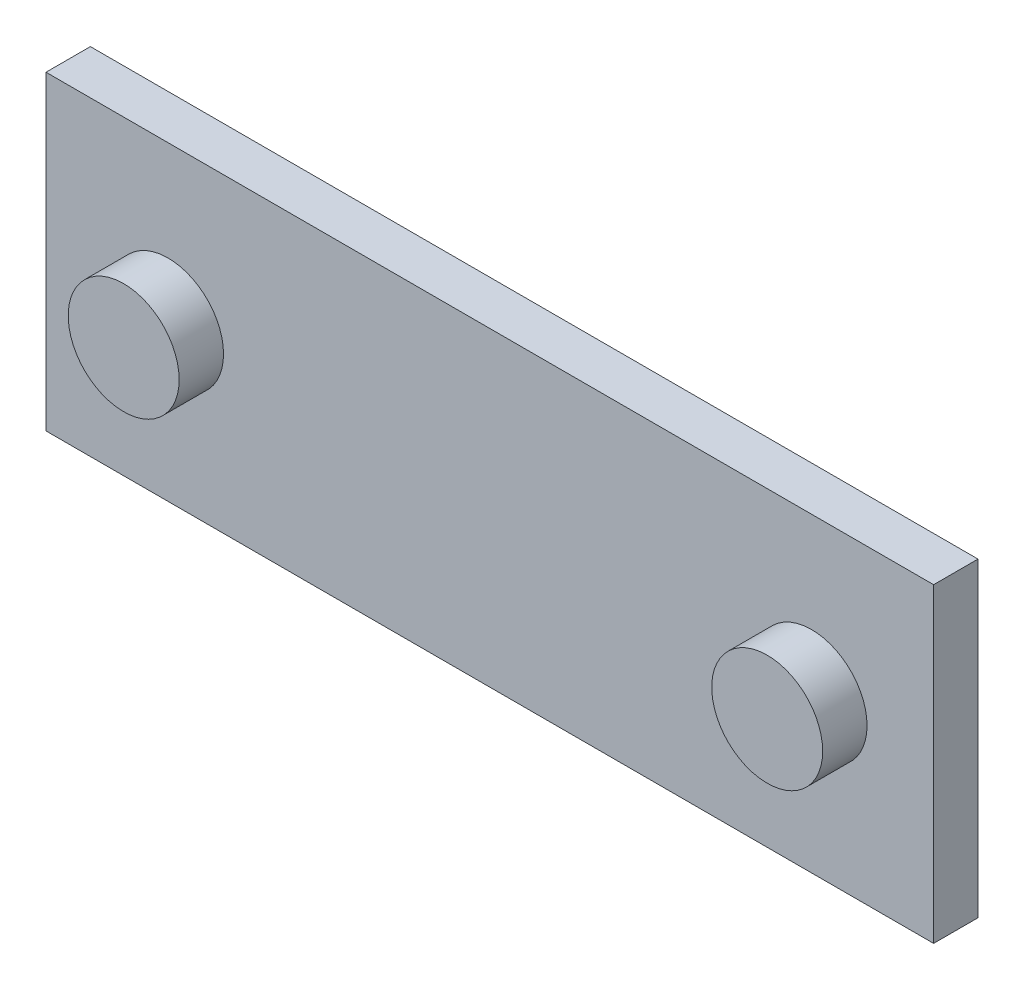
ISO-10303-21;
HEADER;
FILE_DESCRIPTION(('STEP AP214'),'2;1');
FILE_NAME('part.step','',(''),(''),'','','');
FILE_SCHEMA(('AUTOMOTIVE_DESIGN { 1 0 10303 214 1 1 1 1 }'));
ENDSEC;
DATA;
#1=APPLICATION_CONTEXT('core data for automotive mechanical design processes');
#2=APPLICATION_PROTOCOL_DEFINITION('international standard','automotive_design',2000,#1);
#3=PRODUCT_CONTEXT('',#1,'mechanical');
#4=PRODUCT('Part','Part','',(#3));
#5=PRODUCT_RELATED_PRODUCT_CATEGORY('part','',(#4));
#6=PRODUCT_DEFINITION_FORMATION('','',#4);
#7=PRODUCT_DEFINITION_CONTEXT('part definition',#1,'design');
#8=PRODUCT_DEFINITION('design','',#6,#7);
#9=PRODUCT_DEFINITION_SHAPE('','',#8);
#10=(LENGTH_UNIT() NAMED_UNIT(*) SI_UNIT(.MILLI.,.METRE.));
#11=(NAMED_UNIT(*) PLANE_ANGLE_UNIT() SI_UNIT($,.RADIAN.));
#12=(NAMED_UNIT(*) SI_UNIT($,.STERADIAN.) SOLID_ANGLE_UNIT());
#13=UNCERTAINTY_MEASURE_WITH_UNIT(LENGTH_MEASURE(1.E-05),#10,'distance_accuracy_value','');
#14=(GEOMETRIC_REPRESENTATION_CONTEXT(3) GLOBAL_UNCERTAINTY_ASSIGNED_CONTEXT((#13)) GLOBAL_UNIT_ASSIGNED_CONTEXT((#10,
#11,#12)) REPRESENTATION_CONTEXT('',''));
#15=CARTESIAN_POINT('',(0.,0.,0.));
#16=DIRECTION('',(0.,0.,1.));
#17=DIRECTION('',(1.,0.,0.));
#18=AXIS2_PLACEMENT_3D('',#15,#16,#17);
#19=CARTESIAN_POINT('',(-10.,-3.5,1.));
#20=DIRECTION('',(1.,0.,0.));
#21=DIRECTION('',(0.,0.,-1.));
#22=AXIS2_PLACEMENT_3D('',#19,#20,#21);
#23=PLANE('',#22);
#24=DIRECTION('',(0.,-1.,0.));
#25=VECTOR('',#24,1.);
#26=CARTESIAN_POINT('',(-10.,-3.5,0.));
#27=LINE('',#26,#25);
#28=CARTESIAN_POINT('',(-10.,3.5,0.));
#29=VERTEX_POINT('',#28);
#30=CARTESIAN_POINT('',(-10.,-3.5,0.));
#31=VERTEX_POINT('',#30);
#32=EDGE_CURVE('E107',#29,#31,#27,.T.);
#33=ORIENTED_EDGE('',*,*,#32,.T.);
#34=DIRECTION('',(0.,0.,-1.));
#35=VECTOR('',#34,1.);
#36=CARTESIAN_POINT('',(-10.,-3.5,1.));
#37=LINE('',#36,#35);
#38=CARTESIAN_POINT('',(-10.,-3.5,1.));
#39=VERTEX_POINT('',#38);
#40=EDGE_CURVE('E11',#39,#31,#37,.T.);
#41=ORIENTED_EDGE('',*,*,#40,.F.);
#42=DIRECTION('',(0.,-1.,0.));
#43=VECTOR('',#42,1.);
#44=CARTESIAN_POINT('',(-10.,-3.5,1.));
#45=LINE('',#44,#43);
#46=CARTESIAN_POINT('',(-10.,3.5,1.));
#47=VERTEX_POINT('',#46);
#48=EDGE_CURVE('E91',#47,#39,#45,.T.);
#49=ORIENTED_EDGE('',*,*,#48,.F.);
#50=DIRECTION('',(0.,0.,-1.));
#51=VECTOR('',#50,1.);
#52=CARTESIAN_POINT('',(-10.,3.5,1.));
#53=LINE('',#52,#51);
#54=EDGE_CURVE('E103',#47,#29,#53,.T.);
#55=ORIENTED_EDGE('',*,*,#54,.T.);
#56=EDGE_LOOP('',(#33,#41,#49,#55));
#57=FACE_BOUND('',#56,.T.);
#58=ADVANCED_FACE('F39',(#57),#23,.F.);
#59=CARTESIAN_POINT('',(10.,-3.5,1.));
#60=DIRECTION('',(0.,1.,0.));
#61=DIRECTION('',(-1.,0.,0.));
#62=AXIS2_PLACEMENT_3D('',#59,#60,#61);
#63=PLANE('',#62);
#64=DIRECTION('',(1.,0.,0.));
#65=VECTOR('',#64,1.);
#66=CARTESIAN_POINT('',(10.,-3.5,0.));
#67=LINE('',#66,#65);
#68=CARTESIAN_POINT('',(10.,-3.5,0.));
#69=VERTEX_POINT('',#68);
#70=EDGE_CURVE('E96',#31,#69,#67,.T.);
#71=ORIENTED_EDGE('',*,*,#70,.T.);
#72=DIRECTION('',(0.,0.,-1.));
#73=VECTOR('',#72,1.);
#74=CARTESIAN_POINT('',(10.,-3.5,1.));
#75=LINE('',#74,#73);
#76=CARTESIAN_POINT('',(10.,-3.5,1.));
#77=VERTEX_POINT('',#76);
#78=EDGE_CURVE('E48',#77,#69,#75,.T.);
#79=ORIENTED_EDGE('',*,*,#78,.F.);
#80=DIRECTION('',(1.,0.,0.));
#81=VECTOR('',#80,1.);
#82=CARTESIAN_POINT('',(10.,-3.5,1.));
#83=LINE('',#82,#81);
#84=EDGE_CURVE('E86',#39,#77,#83,.T.);
#85=ORIENTED_EDGE('',*,*,#84,.F.);
#86=ORIENTED_EDGE('',*,*,#40,.T.);
#87=EDGE_LOOP('',(#71,#79,#85,#86));
#88=FACE_BOUND('',#87,.T.);
#89=ADVANCED_FACE('F95',(#88),#63,.F.);
#90=CARTESIAN_POINT('',(10.,-3.5,1.));
#91=DIRECTION('',(-1.,0.,0.));
#92=DIRECTION('',(0.,0.,1.));
#93=AXIS2_PLACEMENT_3D('',#90,#91,#92);
#94=PLANE('',#93);
#95=DIRECTION('',(0.,1.,0.));
#96=VECTOR('',#95,1.);
#97=CARTESIAN_POINT('',(10.,-3.5,0.));
#98=LINE('',#97,#96);
#99=CARTESIAN_POINT('',(10.,3.5,0.));
#100=VERTEX_POINT('',#99);
#101=EDGE_CURVE('E73',#69,#100,#98,.T.);
#102=ORIENTED_EDGE('',*,*,#101,.T.);
#103=DIRECTION('',(0.,0.,-1.));
#104=VECTOR('',#103,1.);
#105=CARTESIAN_POINT('',(10.,3.5,1.));
#106=LINE('',#105,#104);
#107=CARTESIAN_POINT('',(10.,3.5,1.));
#108=VERTEX_POINT('',#107);
#109=EDGE_CURVE('E98',#108,#100,#106,.T.);
#110=ORIENTED_EDGE('',*,*,#109,.F.);
#111=DIRECTION('',(0.,1.,0.));
#112=VECTOR('',#111,1.);
#113=CARTESIAN_POINT('',(10.,-3.5,1.));
#114=LINE('',#113,#112);
#115=EDGE_CURVE('E89',#77,#108,#114,.T.);
#116=ORIENTED_EDGE('',*,*,#115,.F.);
#117=ORIENTED_EDGE('',*,*,#78,.T.);
#118=EDGE_LOOP('',(#102,#110,#116,#117));
#119=FACE_BOUND('',#118,.T.);
#120=ADVANCED_FACE('F99',(#119),#94,.F.);
#121=CARTESIAN_POINT('',(10.,3.5,1.));
#122=DIRECTION('',(0.,-1.,0.));
#123=DIRECTION('',(1.,0.,0.));
#124=AXIS2_PLACEMENT_3D('',#121,#122,#123);
#125=PLANE('',#124);
#126=DIRECTION('',(-1.,0.,0.));
#127=VECTOR('',#126,1.);
#128=CARTESIAN_POINT('',(10.,3.5,0.));
#129=LINE('',#128,#127);
#130=EDGE_CURVE('E79',#100,#29,#129,.T.);
#131=ORIENTED_EDGE('',*,*,#130,.T.);
#132=ORIENTED_EDGE('',*,*,#54,.F.);
#133=DIRECTION('',(-1.,0.,0.));
#134=VECTOR('',#133,1.);
#135=CARTESIAN_POINT('',(10.,3.5,1.));
#136=LINE('',#135,#134);
#137=EDGE_CURVE('E56',#108,#47,#136,.T.);
#138=ORIENTED_EDGE('',*,*,#137,.F.);
#139=ORIENTED_EDGE('',*,*,#109,.T.);
#140=EDGE_LOOP('',(#131,#132,#138,#139));
#141=FACE_BOUND('',#140,.T.);
#142=ADVANCED_FACE('F121',(#141),#125,.F.);
#143=CARTESIAN_POINT('',(0.,0.,1.));
#144=DIRECTION('',(0.,0.,1.));
#145=DIRECTION('',(1.,0.,0.));
#146=AXIS2_PLACEMENT_3D('',#143,#144,#145);
#147=PLANE('',#146);
#148=CARTESIAN_POINT('',(7.25,0.,1.));
#149=DIRECTION('',(0.,0.,1.));
#150=DIRECTION('',(1.,0.,0.));
#151=AXIS2_PLACEMENT_3D('',#148,#149,#150);
#152=CIRCLE('',#151,1.25);
#153=CARTESIAN_POINT('',(8.5,0.,1.));
#154=VERTEX_POINT('',#153);
#155=EDGE_CURVE('E136',#154,#154,#152,.T.);
#156=ORIENTED_EDGE('',*,*,#155,.F.);
#157=EDGE_LOOP('',(#156));
#158=FACE_BOUND('',#157,.T.);
#159=CARTESIAN_POINT('',(-7.25,0.,1.));
#160=DIRECTION('',(0.,0.,1.));
#161=DIRECTION('',(1.,0.,0.));
#162=AXIS2_PLACEMENT_3D('',#159,#160,#161);
#163=CIRCLE('',#162,1.25);
#164=CARTESIAN_POINT('',(-6.,0.,1.));
#165=VERTEX_POINT('',#164);
#166=EDGE_CURVE('E128',#165,#165,#163,.T.);
#167=ORIENTED_EDGE('',*,*,#166,.F.);
#168=EDGE_LOOP('',(#167));
#169=FACE_BOUND('',#168,.T.);
#170=ORIENTED_EDGE('',*,*,#48,.T.);
#171=ORIENTED_EDGE('',*,*,#84,.T.);
#172=ORIENTED_EDGE('',*,*,#115,.T.);
#173=ORIENTED_EDGE('',*,*,#137,.T.);
#174=EDGE_LOOP('',(#170,#171,#172,#173));
#175=FACE_BOUND('',#174,.T.);
#176=ADVANCED_FACE('F87',(#158,#169,#175),#147,.T.);
#177=CARTESIAN_POINT('',(0.,0.,0.));
#178=DIRECTION('',(0.,0.,1.));
#179=DIRECTION('',(1.,0.,0.));
#180=AXIS2_PLACEMENT_3D('',#177,#178,#179);
#181=PLANE('',#180);
#182=ORIENTED_EDGE('',*,*,#32,.F.);
#183=ORIENTED_EDGE('',*,*,#130,.F.);
#184=ORIENTED_EDGE('',*,*,#101,.F.);
#185=ORIENTED_EDGE('',*,*,#70,.F.);
#186=EDGE_LOOP('',(#182,#183,#184,#185));
#187=FACE_BOUND('',#186,.T.);
#188=ADVANCED_FACE('F124',(#187),#181,.F.);
#189=CARTESIAN_POINT('',(-7.25,0.,2.));
#190=DIRECTION('',(0.,0.,-1.));
#191=DIRECTION('',(-1.,0.,0.));
#192=AXIS2_PLACEMENT_3D('',#189,#190,#191);
#193=CYLINDRICAL_SURFACE('',#192,1.25);
#194=CARTESIAN_POINT('',(-7.25,0.,2.));
#195=DIRECTION('',(0.,0.,1.));
#196=DIRECTION('',(1.,0.,0.));
#197=AXIS2_PLACEMENT_3D('',#194,#195,#196);
#198=CIRCLE('',#197,1.25);
#199=CARTESIAN_POINT('',(-6.,0.,2.));
#200=VERTEX_POINT('',#199);
#201=EDGE_CURVE('E111',#200,#200,#198,.T.);
#202=ORIENTED_EDGE('',*,*,#201,.F.);
#203=EDGE_LOOP('',(#202));
#204=FACE_BOUND('',#203,.T.);
#205=ORIENTED_EDGE('',*,*,#166,.T.);
#206=EDGE_LOOP('',(#205));
#207=FACE_BOUND('',#206,.T.);
#208=ADVANCED_FACE('F158',(#204,#207),#193,.T.);
#209=CARTESIAN_POINT('',(-7.25,0.,2.));
#210=DIRECTION('',(0.,0.,1.));
#211=DIRECTION('',(1.,0.,0.));
#212=AXIS2_PLACEMENT_3D('',#209,#210,#211);
#213=PLANE('',#212);
#214=ORIENTED_EDGE('',*,*,#201,.T.);
#215=EDGE_LOOP('',(#214));
#216=FACE_BOUND('',#215,.T.);
#217=ADVANCED_FACE('F149',(#216),#213,.T.);
#218=CARTESIAN_POINT('',(7.25,0.,2.));
#219=DIRECTION('',(0.,0.,-1.));
#220=DIRECTION('',(-1.,0.,0.));
#221=AXIS2_PLACEMENT_3D('',#218,#219,#220);
#222=CYLINDRICAL_SURFACE('',#221,1.25);
#223=CARTESIAN_POINT('',(7.25,0.,2.));
#224=DIRECTION('',(0.,0.,1.));
#225=DIRECTION('',(1.,0.,0.));
#226=AXIS2_PLACEMENT_3D('',#223,#224,#225);
#227=CIRCLE('',#226,1.25);
#228=CARTESIAN_POINT('',(8.5,0.,2.));
#229=VERTEX_POINT('',#228);
#230=EDGE_CURVE('E132',#229,#229,#227,.T.);
#231=ORIENTED_EDGE('',*,*,#230,.F.);
#232=EDGE_LOOP('',(#231));
#233=FACE_BOUND('',#232,.T.);
#234=ORIENTED_EDGE('',*,*,#155,.T.);
#235=EDGE_LOOP('',(#234));
#236=FACE_BOUND('',#235,.T.);
#237=ADVANCED_FACE('F146',(#233,#236),#222,.T.);
#238=CARTESIAN_POINT('',(7.25,0.,2.));
#239=DIRECTION('',(0.,0.,1.));
#240=DIRECTION('',(1.,0.,0.));
#241=AXIS2_PLACEMENT_3D('',#238,#239,#240);
#242=PLANE('',#241);
#243=ORIENTED_EDGE('',*,*,#230,.T.);
#244=EDGE_LOOP('',(#243));
#245=FACE_BOUND('',#244,.T.);
#246=ADVANCED_FACE('F144',(#245),#242,.T.);
#247=CLOSED_SHELL('',(#58,#89,#120,#142,#176,#188,#208,#217,#237,#246));
#248=MANIFOLD_SOLID_BREP('B2',#247);
#249=ADVANCED_BREP_SHAPE_REPRESENTATION('',(#18,#248),#14);
#250=SHAPE_DEFINITION_REPRESENTATION(#9,#249);
ENDSEC;
END-ISO-10303-21;
